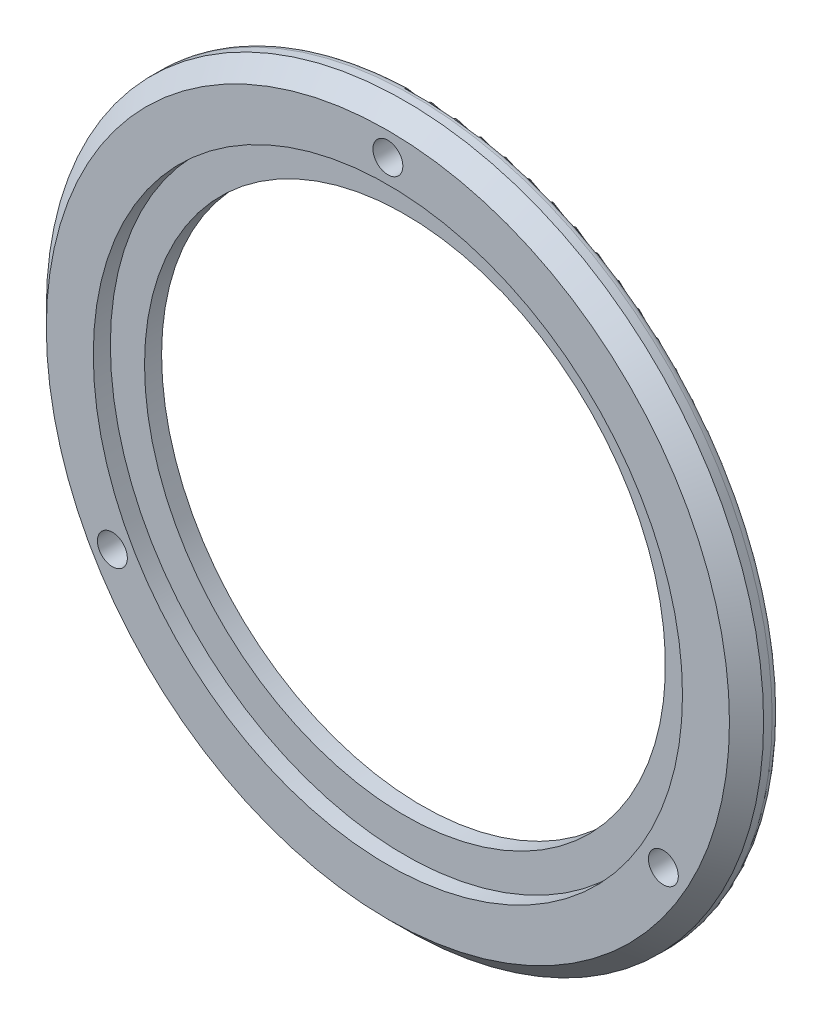
ISO-10303-21;
HEADER;
FILE_DESCRIPTION(('STEP AP214'),'2;1');
FILE_NAME('part.step','',(''),(''),'','','');
FILE_SCHEMA(('AUTOMOTIVE_DESIGN { 1 0 10303 214 1 1 1 1 }'));
ENDSEC;
DATA;
#1=APPLICATION_CONTEXT('core data for automotive mechanical design processes');
#2=APPLICATION_PROTOCOL_DEFINITION('international standard','automotive_design',2000,#1);
#3=PRODUCT_CONTEXT('',#1,'mechanical');
#4=PRODUCT('Part','Part','',(#3));
#5=PRODUCT_RELATED_PRODUCT_CATEGORY('part','',(#4));
#6=PRODUCT_DEFINITION_FORMATION('','',#4);
#7=PRODUCT_DEFINITION_CONTEXT('part definition',#1,'design');
#8=PRODUCT_DEFINITION('design','',#6,#7);
#9=PRODUCT_DEFINITION_SHAPE('','',#8);
#10=(LENGTH_UNIT() NAMED_UNIT(*) SI_UNIT(.MILLI.,.METRE.));
#11=(NAMED_UNIT(*) PLANE_ANGLE_UNIT() SI_UNIT($,.RADIAN.));
#12=(NAMED_UNIT(*) SI_UNIT($,.STERADIAN.) SOLID_ANGLE_UNIT());
#13=UNCERTAINTY_MEASURE_WITH_UNIT(LENGTH_MEASURE(1.E-05),#10,'distance_accuracy_value','');
#14=(GEOMETRIC_REPRESENTATION_CONTEXT(3) GLOBAL_UNCERTAINTY_ASSIGNED_CONTEXT((#13)) GLOBAL_UNIT_ASSIGNED_CONTEXT((#10,
#11,#12)) REPRESENTATION_CONTEXT('',''));
#15=CARTESIAN_POINT('',(0.,0.,0.));
#16=DIRECTION('',(0.,0.,1.));
#17=DIRECTION('',(1.,0.,0.));
#18=AXIS2_PLACEMENT_3D('',#15,#16,#17);
#19=CARTESIAN_POINT('',(0.,0.,4.));
#20=DIRECTION('',(0.,0.,-1.));
#21=DIRECTION('',(-1.,0.,0.));
#22=AXIS2_PLACEMENT_3D('',#19,#20,#21);
#23=CYLINDRICAL_SURFACE('',#22,30.5);
#24=CARTESIAN_POINT('',(0.,0.,0.));
#25=DIRECTION('',(0.,0.,1.));
#26=DIRECTION('',(1.,0.,0.));
#27=AXIS2_PLACEMENT_3D('',#24,#25,#26);
#28=CIRCLE('',#27,30.5);
#29=CARTESIAN_POINT('',(-30.5,0.,0.));
#30=VERTEX_POINT('',#29);
#31=EDGE_CURVE('E70',#30,#30,#28,.T.);
#32=CARTESIAN_POINT('',(0.,0.,2.));
#33=DIRECTION('',(0.,0.,1.));
#34=DIRECTION('',(1.,0.,0.));
#35=AXIS2_PLACEMENT_3D('',#32,#33,#34);
#36=CIRCLE('',#35,30.5);
#37=CARTESIAN_POINT('',(-30.5,0.,2.));
#38=VERTEX_POINT('',#37);
#39=EDGE_CURVE('E68',#38,#38,#36,.T.);
#40=CARTESIAN_POINT('',(-30.5,0.,0.));
#41=CARTESIAN_POINT('',(-30.5,0.,0.0208333333333325));
#42=CARTESIAN_POINT('',(-30.5,0.,0.0416666666666658));
#43=CARTESIAN_POINT('',(-30.5,0.,0.0833333333333326));
#44=CARTESIAN_POINT('',(-30.5,0.,0.104166666666666));
#45=CARTESIAN_POINT('',(-30.5,0.,0.145833333333333));
#46=CARTESIAN_POINT('',(-30.5,0.,0.166666666666666));
#47=CARTESIAN_POINT('',(-30.5,0.,0.208333333333333));
#48=CARTESIAN_POINT('',(-30.5,0.,0.229166666666666));
#49=CARTESIAN_POINT('',(-30.5,0.,0.270833333333333));
#50=CARTESIAN_POINT('',(-30.5,0.,0.291666666666666));
#51=CARTESIAN_POINT('',(-30.5,0.,0.333333333333333));
#52=CARTESIAN_POINT('',(-30.5,0.,0.354166666666666));
#53=CARTESIAN_POINT('',(-30.5,0.,0.395833333333333));
#54=CARTESIAN_POINT('',(-30.5,0.,0.416666666666666));
#55=CARTESIAN_POINT('',(-30.5,0.,0.458333333333333));
#56=CARTESIAN_POINT('',(-30.5,0.,0.479166666666666));
#57=CARTESIAN_POINT('',(-30.5,0.,0.520833333333333));
#58=CARTESIAN_POINT('',(-30.5,0.,0.541666666666666));
#59=CARTESIAN_POINT('',(-30.5,0.,0.583333333333333));
#60=CARTESIAN_POINT('',(-30.5,0.,0.604166666666666));
#61=CARTESIAN_POINT('',(-30.5,0.,0.645833333333333));
#62=CARTESIAN_POINT('',(-30.5,0.,0.666666666666667));
#63=CARTESIAN_POINT('',(-30.5,0.,0.708333333333333));
#64=CARTESIAN_POINT('',(-30.5,0.,0.729166666666667));
#65=CARTESIAN_POINT('',(-30.5,0.,0.770833333333334));
#66=CARTESIAN_POINT('',(-30.5,0.,0.791666666666667));
#67=CARTESIAN_POINT('',(-30.5,0.,0.833333333333334));
#68=CARTESIAN_POINT('',(-30.5,0.,0.854166666666667));
#69=CARTESIAN_POINT('',(-30.5,0.,0.895833333333334));
#70=CARTESIAN_POINT('',(-30.5,0.,0.916666666666667));
#71=CARTESIAN_POINT('',(-30.5,0.,0.958333333333334));
#72=CARTESIAN_POINT('',(-30.5,0.,0.979166666666667));
#73=CARTESIAN_POINT('',(-30.5,0.,1.02083333333333));
#74=CARTESIAN_POINT('',(-30.5,0.,1.04166666666667));
#75=CARTESIAN_POINT('',(-30.5,0.,1.08333333333333));
#76=CARTESIAN_POINT('',(-30.5,0.,1.10416666666667));
#77=CARTESIAN_POINT('',(-30.5,0.,1.14583333333333));
#78=CARTESIAN_POINT('',(-30.5,0.,1.16666666666667));
#79=CARTESIAN_POINT('',(-30.5,0.,1.20833333333333));
#80=CARTESIAN_POINT('',(-30.5,0.,1.22916666666667));
#81=CARTESIAN_POINT('',(-30.5,0.,1.27083333333333));
#82=CARTESIAN_POINT('',(-30.5,0.,1.29166666666667));
#83=CARTESIAN_POINT('',(-30.5,0.,1.33333333333333));
#84=CARTESIAN_POINT('',(-30.5,0.,1.35416666666667));
#85=CARTESIAN_POINT('',(-30.5,0.,1.39583333333333));
#86=CARTESIAN_POINT('',(-30.5,0.,1.41666666666667));
#87=CARTESIAN_POINT('',(-30.5,0.,1.45833333333333));
#88=CARTESIAN_POINT('',(-30.5,0.,1.47916666666667));
#89=CARTESIAN_POINT('',(-30.5,0.,1.52083333333333));
#90=CARTESIAN_POINT('',(-30.5,0.,1.54166666666667));
#91=CARTESIAN_POINT('',(-30.5,0.,1.58333333333333));
#92=CARTESIAN_POINT('',(-30.5,0.,1.60416666666667));
#93=CARTESIAN_POINT('',(-30.5,0.,1.64583333333333));
#94=CARTESIAN_POINT('',(-30.5,0.,1.66666666666667));
#95=CARTESIAN_POINT('',(-30.5,0.,1.70833333333333));
#96=CARTESIAN_POINT('',(-30.5,0.,1.72916666666667));
#97=CARTESIAN_POINT('',(-30.5,0.,1.77083333333333));
#98=CARTESIAN_POINT('',(-30.5,0.,1.79166666666667));
#99=CARTESIAN_POINT('',(-30.5,0.,1.83333333333333));
#100=CARTESIAN_POINT('',(-30.5,0.,1.85416666666667));
#101=CARTESIAN_POINT('',(-30.5,0.,1.89583333333333));
#102=CARTESIAN_POINT('',(-30.5,0.,1.91666666666667));
#103=CARTESIAN_POINT('',(-30.5,0.,1.95833333333333));
#104=CARTESIAN_POINT('',(-30.5,0.,1.97916666666667));
#105=CARTESIAN_POINT('',(-30.5,0.,2.));
#106=B_SPLINE_CURVE_WITH_KNOTS('',3,(#40,#41,#42,#43,#44,#45,#46,#47,#48,#49,#50,#51,#52,#53,
#54,#55,#56,#57,#58,#59,#60,#61,#62,#63,#64,#65,#66,#67,#68,#69,#70,#71,#72,#73,#74,#75,#76,#77,
#78,#79,#80,#81,#82,#83,#84,#85,#86,#87,#88,#89,#90,#91,#92,#93,#94,#95,#96,#97,#98,#99,#100,
#101,#102,#103,#104,#105),.UNSPECIFIED.,.F.,.F.,(4,2,2,2,2,2,2,2,2,2,2,2,2,2,2,2,2,2,2,2,2,2,2,
2,2,2,2,2,2,2,2,2,4),(0.,0.0625000000000001,0.125,0.1875,0.25,0.3125,0.375,0.4375,0.5,0.5625,
0.625000000000001,0.687500000000001,0.750000000000001,0.812500000000001,0.875000000000001,
0.937500000000001,1.,1.0625,1.125,1.1875,1.25,1.3125,1.375,1.4375,1.5,1.5625,1.625,1.6875,1.75,
1.8125,1.875,1.9375,2.),.UNSPECIFIED.);
#107=EDGE_CURVE('BSEAM50',#30,#38,#106,.T.);
#108=ORIENTED_EDGE('',*,*,#31,.F.);
#109=ORIENTED_EDGE('',*,*,#39,.T.);
#110=ORIENTED_EDGE('',*,*,#107,.T.);
#111=ORIENTED_EDGE('',*,*,#107,.F.);
#112=EDGE_LOOP('',(#108,#110,#109,#111));
#113=FACE_BOUND('',#112,.T.);
#114=ADVANCED_FACE('F50',(#113),#23,.F.);
#115=CARTESIAN_POINT('',(0.,0.,4.));
#116=DIRECTION('',(0.,0.,1.));
#117=DIRECTION('',(1.,0.,0.));
#118=AXIS2_PLACEMENT_3D('',#115,#116,#117);
#119=PLANE('',#118);
#120=CARTESIAN_POINT('',(32.2594462909727,-18.6249999999986,4.));
#121=DIRECTION('',(0.,0.,1.));
#122=DIRECTION('',(1.,0.,0.));
#123=AXIS2_PLACEMENT_3D('',#120,#121,#122);
#124=CIRCLE('',#123,1.75);
#125=CARTESIAN_POINT('',(34.0094462909727,-18.6249999999986,4.));
#126=VERTEX_POINT('',#125);
#127=EDGE_CURVE('E86',#126,#126,#124,.T.);
#128=ORIENTED_EDGE('',*,*,#127,.F.);
#129=EDGE_LOOP('',(#128));
#130=FACE_BOUND('',#129,.T.);
#131=CARTESIAN_POINT('',(0.,37.25,4.00000000000003));
#132=DIRECTION('',(0.,0.,1.));
#133=DIRECTION('',(1.,0.,0.));
#134=AXIS2_PLACEMENT_3D('',#131,#132,#133);
#135=CIRCLE('',#134,1.75);
#136=CARTESIAN_POINT('',(1.75,37.25,4.00000000000003));
#137=VERTEX_POINT('',#136);
#138=EDGE_CURVE('E92',#137,#137,#135,.T.);
#139=ORIENTED_EDGE('',*,*,#138,.F.);
#140=EDGE_LOOP('',(#139));
#141=FACE_BOUND('',#140,.T.);
#142=CARTESIAN_POINT('',(-32.259446290968,-18.6250000000014,4.00000000000003));
#143=DIRECTION('',(0.,0.,1.));
#144=DIRECTION('',(1.,0.,0.));
#145=AXIS2_PLACEMENT_3D('',#142,#143,#144);
#146=CIRCLE('',#145,1.75);
#147=CARTESIAN_POINT('',(-30.509446290968,-18.6250000000014,4.00000000000003));
#148=VERTEX_POINT('',#147);
#149=EDGE_CURVE('E83',#148,#148,#146,.T.);
#150=ORIENTED_EDGE('',*,*,#149,.F.);
#151=EDGE_LOOP('',(#150));
#152=FACE_BOUND('',#151,.T.);
#153=CARTESIAN_POINT('',(0.,0.,4.));
#154=DIRECTION('',(0.,0.,1.));
#155=DIRECTION('',(1.,0.,0.));
#156=AXIS2_PLACEMENT_3D('',#153,#154,#155);
#157=CIRCLE('',#156,34.5);
#158=CARTESIAN_POINT('',(34.5,0.,4.));
#159=VERTEX_POINT('',#158);
#160=EDGE_CURVE('E77',#159,#159,#157,.T.);
#161=ORIENTED_EDGE('',*,*,#160,.F.);
#162=EDGE_LOOP('',(#161));
#163=FACE_BOUND('',#162,.T.);
#164=CARTESIAN_POINT('',(0.,0.,4.));
#165=DIRECTION('',(0.,0.,1.));
#166=DIRECTION('',(1.,0.,0.));
#167=AXIS2_PLACEMENT_3D('',#164,#165,#166);
#168=CIRCLE('',#167,40.);
#169=CARTESIAN_POINT('',(-40.,0.,4.));
#170=VERTEX_POINT('',#169);
#171=EDGE_CURVE('E65',#170,#170,#168,.T.);
#172=ORIENTED_EDGE('',*,*,#171,.T.);
#173=EDGE_LOOP('',(#172));
#174=FACE_BOUND('',#173,.T.);
#175=ADVANCED_FACE('F103',(#130,#141,#152,#163,#174),#119,.T.);
#176=CARTESIAN_POINT('',(0.,0.,0.));
#177=DIRECTION('',(0.,0.,1.));
#178=DIRECTION('',(1.,0.,0.));
#179=AXIS2_PLACEMENT_3D('',#176,#177,#178);
#180=PLANE('',#179);
#181=CARTESIAN_POINT('',(0.,0.,0.));
#182=DIRECTION('',(0.,0.,1.));
#183=DIRECTION('',(1.,0.,0.));
#184=AXIS2_PLACEMENT_3D('',#181,#182,#183);
#185=CIRCLE('',#184,41.);
#186=CARTESIAN_POINT('',(41.,0.,0.));
#187=VERTEX_POINT('',#186);
#188=EDGE_CURVE('E12',#187,#187,#185,.F.);
#189=ORIENTED_EDGE('',*,*,#188,.T.);
#190=EDGE_LOOP('',(#189));
#191=FACE_BOUND('',#190,.T.);
#192=CARTESIAN_POINT('',(32.2594462909727,-18.6249999999986,0.));
#193=DIRECTION('',(0.,0.,1.));
#194=DIRECTION('',(1.,0.,0.));
#195=AXIS2_PLACEMENT_3D('',#192,#193,#194);
#196=CIRCLE('',#195,1.75);
#197=CARTESIAN_POINT('',(34.0094462909727,-18.6249999999986,0.));
#198=VERTEX_POINT('',#197);
#199=EDGE_CURVE('E95',#198,#198,#196,.T.);
#200=ORIENTED_EDGE('',*,*,#199,.T.);
#201=EDGE_LOOP('',(#200));
#202=FACE_BOUND('',#201,.T.);
#203=CARTESIAN_POINT('',(0.,37.25,0.));
#204=DIRECTION('',(0.,0.,1.));
#205=DIRECTION('',(1.,0.,0.));
#206=AXIS2_PLACEMENT_3D('',#203,#204,#205);
#207=CIRCLE('',#206,1.75);
#208=CARTESIAN_POINT('',(1.75,37.25,0.));
#209=VERTEX_POINT('',#208);
#210=EDGE_CURVE('E89',#209,#209,#207,.T.);
#211=ORIENTED_EDGE('',*,*,#210,.T.);
#212=EDGE_LOOP('',(#211));
#213=FACE_BOUND('',#212,.T.);
#214=CARTESIAN_POINT('',(-32.259446290968,-18.6250000000014,0.));
#215=DIRECTION('',(0.,0.,1.));
#216=DIRECTION('',(1.,0.,0.));
#217=AXIS2_PLACEMENT_3D('',#214,#215,#216);
#218=CIRCLE('',#217,1.75);
#219=CARTESIAN_POINT('',(-30.509446290968,-18.6250000000014,0.));
#220=VERTEX_POINT('',#219);
#221=EDGE_CURVE('E80',#220,#220,#218,.T.);
#222=ORIENTED_EDGE('',*,*,#221,.T.);
#223=EDGE_LOOP('',(#222));
#224=FACE_BOUND('',#223,.T.);
#225=ORIENTED_EDGE('',*,*,#31,.T.);
#226=EDGE_LOOP('',(#225));
#227=FACE_BOUND('',#226,.T.);
#228=ADVANCED_FACE('F106',(#191,#202,#213,#224,#227),#180,.F.);
#229=CARTESIAN_POINT('',(0.,0.,4.));
#230=DIRECTION('',(0.,0.,-1.));
#231=DIRECTION('',(-1.,0.,0.));
#232=AXIS2_PLACEMENT_3D('',#229,#230,#231);
#233=CYLINDRICAL_SURFACE('',#232,42.);
#234=CARTESIAN_POINT('',(0.,0.,1.));
#235=DIRECTION('',(0.,0.,1.));
#236=DIRECTION('',(1.,0.,0.));
#237=AXIS2_PLACEMENT_3D('',#234,#235,#236);
#238=CIRCLE('',#237,42.);
#239=CARTESIAN_POINT('',(-42.,0.,1.));
#240=VERTEX_POINT('',#239);
#241=EDGE_CURVE('E57',#240,#240,#238,.T.);
#242=CARTESIAN_POINT('',(0.,0.,1.99999999999997));
#243=DIRECTION('',(0.,0.,1.));
#244=DIRECTION('',(1.,0.,0.));
#245=AXIS2_PLACEMENT_3D('',#242,#243,#244);
#246=CIRCLE('',#245,42.);
#247=CARTESIAN_POINT('',(-42.,0.,1.99999999999997));
#248=VERTEX_POINT('',#247);
#249=EDGE_CURVE('E61',#248,#248,#246,.F.);
#250=CARTESIAN_POINT('',(-42.,0.,1.));
#251=CARTESIAN_POINT('',(-42.,0.,1.01041666666667));
#252=CARTESIAN_POINT('',(-42.,0.,1.02083333333333));
#253=CARTESIAN_POINT('',(-42.,0.,1.04166666666667));
#254=CARTESIAN_POINT('',(-42.,0.,1.05208333333333));
#255=CARTESIAN_POINT('',(-42.,0.,1.07291666666667));
#256=CARTESIAN_POINT('',(-42.,0.,1.08333333333333));
#257=CARTESIAN_POINT('',(-42.,0.,1.10416666666666));
#258=CARTESIAN_POINT('',(-42.,0.,1.11458333333333));
#259=CARTESIAN_POINT('',(-42.,0.,1.13541666666666));
#260=CARTESIAN_POINT('',(-42.,0.,1.14583333333333));
#261=CARTESIAN_POINT('',(-42.,0.,1.16666666666666));
#262=CARTESIAN_POINT('',(-42.,0.,1.17708333333333));
#263=CARTESIAN_POINT('',(-42.,0.,1.19791666666666));
#264=CARTESIAN_POINT('',(-42.,0.,1.20833333333333));
#265=CARTESIAN_POINT('',(-42.,0.,1.22916666666666));
#266=CARTESIAN_POINT('',(-42.,0.,1.23958333333333));
#267=CARTESIAN_POINT('',(-42.,0.,1.26041666666666));
#268=CARTESIAN_POINT('',(-42.,0.,1.27083333333333));
#269=CARTESIAN_POINT('',(-42.,0.,1.29166666666666));
#270=CARTESIAN_POINT('',(-42.,0.,1.30208333333333));
#271=CARTESIAN_POINT('',(-42.,0.,1.32291666666666));
#272=CARTESIAN_POINT('',(-42.,0.,1.33333333333332));
#273=CARTESIAN_POINT('',(-42.,0.,1.35416666666666));
#274=CARTESIAN_POINT('',(-42.,0.,1.36458333333332));
#275=CARTESIAN_POINT('',(-42.,0.,1.38541666666666));
#276=CARTESIAN_POINT('',(-42.,0.,1.39583333333332));
#277=CARTESIAN_POINT('',(-42.,0.,1.41666666666666));
#278=CARTESIAN_POINT('',(-42.,0.,1.42708333333332));
#279=CARTESIAN_POINT('',(-42.,0.,1.44791666666666));
#280=CARTESIAN_POINT('',(-42.,0.,1.45833333333332));
#281=CARTESIAN_POINT('',(-42.,0.,1.47916666666665));
#282=CARTESIAN_POINT('',(-42.,0.,1.48958333333332));
#283=CARTESIAN_POINT('',(-42.,0.,1.51041666666665));
#284=CARTESIAN_POINT('',(-42.,0.,1.52083333333332));
#285=CARTESIAN_POINT('',(-42.,0.,1.54166666666665));
#286=CARTESIAN_POINT('',(-42.,0.,1.55208333333332));
#287=CARTESIAN_POINT('',(-42.,0.,1.57291666666665));
#288=CARTESIAN_POINT('',(-42.,0.,1.58333333333332));
#289=CARTESIAN_POINT('',(-42.,0.,1.60416666666665));
#290=CARTESIAN_POINT('',(-42.,0.,1.61458333333332));
#291=CARTESIAN_POINT('',(-42.,0.,1.63541666666665));
#292=CARTESIAN_POINT('',(-42.,0.,1.64583333333332));
#293=CARTESIAN_POINT('',(-42.,0.,1.66666666666665));
#294=CARTESIAN_POINT('',(-42.,0.,1.67708333333332));
#295=CARTESIAN_POINT('',(-42.,0.,1.69791666666665));
#296=CARTESIAN_POINT('',(-42.,0.,1.70833333333331));
#297=CARTESIAN_POINT('',(-42.,0.,1.72916666666665));
#298=CARTESIAN_POINT('',(-42.,0.,1.73958333333331));
#299=CARTESIAN_POINT('',(-42.,0.,1.76041666666665));
#300=CARTESIAN_POINT('',(-42.,0.,1.77083333333331));
#301=CARTESIAN_POINT('',(-42.,0.,1.79166666666665));
#302=CARTESIAN_POINT('',(-42.,0.,1.80208333333331));
#303=CARTESIAN_POINT('',(-42.,0.,1.82291666666664));
#304=CARTESIAN_POINT('',(-42.,0.,1.83333333333331));
#305=CARTESIAN_POINT('',(-42.,0.,1.85416666666664));
#306=CARTESIAN_POINT('',(-42.,0.,1.86458333333331));
#307=CARTESIAN_POINT('',(-42.,0.,1.88541666666664));
#308=CARTESIAN_POINT('',(-42.,0.,1.89583333333331));
#309=CARTESIAN_POINT('',(-42.,0.,1.91666666666664));
#310=CARTESIAN_POINT('',(-42.,0.,1.92708333333331));
#311=CARTESIAN_POINT('',(-42.,0.,1.94791666666664));
#312=CARTESIAN_POINT('',(-42.,0.,1.95833333333331));
#313=CARTESIAN_POINT('',(-42.,0.,1.97916666666664));
#314=CARTESIAN_POINT('',(-42.,0.,1.98958333333331));
#315=CARTESIAN_POINT('',(-42.,0.,1.99999999999997));
#316=B_SPLINE_CURVE_WITH_KNOTS('',3,(#250,#251,#252,#253,#254,#255,#256,#257,#258,#259,#260,
#261,#262,#263,#264,#265,#266,#267,#268,#269,#270,#271,#272,#273,#274,#275,#276,#277,#278,#279,
#280,#281,#282,#283,#284,#285,#286,#287,#288,#289,#290,#291,#292,#293,#294,#295,#296,#297,#298,
#299,#300,#301,#302,#303,#304,#305,#306,#307,#308,#309,#310,#311,#312,#313,#314,#315),
.UNSPECIFIED.,.F.,.F.,(4,2,2,2,2,2,2,2,2,2,2,2,2,2,2,2,2,2,2,2,2,2,2,2,2,2,2,2,2,2,2,2,4),(0.,
0.0312499999999992,0.0624999999999983,0.093749999999997,0.124999999999996,0.156249999999995,
0.187499999999995,0.218749999999994,0.249999999999993,0.281249999999992,0.312499999999991,
0.34374999999999,0.37499999999999,0.406249999999989,0.437499999999988,0.468749999999987,
0.499999999999986,0.531249999999985,0.562499999999984,0.593749999999984,0.624999999999983,
0.656249999999982,0.687499999999981,0.71874999999998,0.749999999999979,0.781249999999979,
0.812499999999978,0.843749999999977,0.874999999999976,0.906249999999975,0.937499999999974,
0.968749999999974,0.999999999999973),.UNSPECIFIED.);
#317=EDGE_CURVE('BSEAM119',#240,#248,#316,.T.);
#318=ORIENTED_EDGE('',*,*,#241,.T.);
#319=ORIENTED_EDGE('',*,*,#249,.T.);
#320=ORIENTED_EDGE('',*,*,#317,.T.);
#321=ORIENTED_EDGE('',*,*,#317,.F.);
#322=EDGE_LOOP('',(#318,#320,#319,#321));
#323=FACE_BOUND('',#322,.T.);
#324=ADVANCED_FACE('F119',(#323),#233,.T.);
#325=CARTESIAN_POINT('',(0.,0.,4.));
#326=DIRECTION('',(0.,0.,-1.));
#327=DIRECTION('',(-1.,0.,0.));
#328=AXIS2_PLACEMENT_3D('',#325,#326,#327);
#329=CONICAL_SURFACE('',#328,40.,0.785398163397441);
#330=CARTESIAN_POINT('',(-42.,0.,1.99999999999997));
#331=CARTESIAN_POINT('',(-41.9791666666667,0.,2.02083333333331));
#332=CARTESIAN_POINT('',(-41.9583333333333,0.,2.04166666666664));
#333=CARTESIAN_POINT('',(-41.9166666666667,0.,2.08333333333331));
#334=CARTESIAN_POINT('',(-41.8958333333333,0.,2.10416666666664));
#335=CARTESIAN_POINT('',(-41.8541666666667,0.,2.14583333333331));
#336=CARTESIAN_POINT('',(-41.8333333333333,0.,2.16666666666664));
#337=CARTESIAN_POINT('',(-41.7916666666667,0.,2.20833333333331));
#338=CARTESIAN_POINT('',(-41.7708333333333,0.,2.22916666666664));
#339=CARTESIAN_POINT('',(-41.7291666666667,0.,2.27083333333331));
#340=CARTESIAN_POINT('',(-41.7083333333333,0.,2.29166666666664));
#341=CARTESIAN_POINT('',(-41.6666666666667,0.,2.33333333333331));
#342=CARTESIAN_POINT('',(-41.6458333333333,0.,2.35416666666665));
#343=CARTESIAN_POINT('',(-41.6041666666667,0.,2.39583333333331));
#344=CARTESIAN_POINT('',(-41.5833333333333,0.,2.41666666666665));
#345=CARTESIAN_POINT('',(-41.5416666666667,0.,2.45833333333331));
#346=CARTESIAN_POINT('',(-41.5208333333333,0.,2.47916666666665));
#347=CARTESIAN_POINT('',(-41.4791666666667,0.,2.52083333333331));
#348=CARTESIAN_POINT('',(-41.4583333333333,0.,2.54166666666665));
#349=CARTESIAN_POINT('',(-41.4166666666667,0.,2.58333333333332));
#350=CARTESIAN_POINT('',(-41.3958333333333,0.,2.60416666666665));
#351=CARTESIAN_POINT('',(-41.3541666666667,0.,2.64583333333332));
#352=CARTESIAN_POINT('',(-41.3333333333333,0.,2.66666666666665));
#353=CARTESIAN_POINT('',(-41.2916666666667,0.,2.70833333333332));
#354=CARTESIAN_POINT('',(-41.2708333333333,0.,2.72916666666665));
#355=CARTESIAN_POINT('',(-41.2291666666667,0.,2.77083333333332));
#356=CARTESIAN_POINT('',(-41.2083333333333,0.,2.79166666666665));
#357=CARTESIAN_POINT('',(-41.1666666666667,0.,2.83333333333332));
#358=CARTESIAN_POINT('',(-41.1458333333333,0.,2.85416666666665));
#359=CARTESIAN_POINT('',(-41.1041666666667,0.,2.89583333333332));
#360=CARTESIAN_POINT('',(-41.0833333333333,0.,2.91666666666665));
#361=CARTESIAN_POINT('',(-41.0416666666667,0.,2.95833333333332));
#362=CARTESIAN_POINT('',(-41.0208333333333,0.,2.97916666666665));
#363=CARTESIAN_POINT('',(-40.9791666666667,0.,3.02083333333332));
#364=CARTESIAN_POINT('',(-40.9583333333333,0.,3.04166666666666));
#365=CARTESIAN_POINT('',(-40.9166666666667,0.,3.08333333333332));
#366=CARTESIAN_POINT('',(-40.8958333333333,0.,3.10416666666666));
#367=CARTESIAN_POINT('',(-40.8541666666667,0.,3.14583333333332));
#368=CARTESIAN_POINT('',(-40.8333333333333,0.,3.16666666666666));
#369=CARTESIAN_POINT('',(-40.7916666666667,0.,3.20833333333332));
#370=CARTESIAN_POINT('',(-40.7708333333333,0.,3.22916666666666));
#371=CARTESIAN_POINT('',(-40.7291666666667,0.,3.27083333333333));
#372=CARTESIAN_POINT('',(-40.7083333333333,0.,3.29166666666666));
#373=CARTESIAN_POINT('',(-40.6666666666667,0.,3.33333333333333));
#374=CARTESIAN_POINT('',(-40.6458333333333,0.,3.35416666666666));
#375=CARTESIAN_POINT('',(-40.6041666666667,0.,3.39583333333333));
#376=CARTESIAN_POINT('',(-40.5833333333333,0.,3.41666666666666));
#377=CARTESIAN_POINT('',(-40.5416666666667,0.,3.45833333333333));
#378=CARTESIAN_POINT('',(-40.5208333333333,0.,3.47916666666666));
#379=CARTESIAN_POINT('',(-40.4791666666667,0.,3.52083333333333));
#380=CARTESIAN_POINT('',(-40.4583333333333,0.,3.54166666666666));
#381=CARTESIAN_POINT('',(-40.4166666666667,0.,3.58333333333333));
#382=CARTESIAN_POINT('',(-40.3958333333333,0.,3.60416666666666));
#383=CARTESIAN_POINT('',(-40.3541666666667,0.,3.64583333333333));
#384=CARTESIAN_POINT('',(-40.3333333333333,0.,3.66666666666666));
#385=CARTESIAN_POINT('',(-40.2916666666667,0.,3.70833333333333));
#386=CARTESIAN_POINT('',(-40.2708333333333,0.,3.72916666666667));
#387=CARTESIAN_POINT('',(-40.2291666666667,0.,3.77083333333333));
#388=CARTESIAN_POINT('',(-40.2083333333333,0.,3.79166666666667));
#389=CARTESIAN_POINT('',(-40.1666666666667,0.,3.83333333333333));
#390=CARTESIAN_POINT('',(-40.1458333333333,0.,3.85416666666667));
#391=CARTESIAN_POINT('',(-40.1041666666667,0.,3.89583333333333));
#392=CARTESIAN_POINT('',(-40.0833333333333,0.,3.91666666666667));
#393=CARTESIAN_POINT('',(-40.0416666666667,0.,3.95833333333334));
#394=CARTESIAN_POINT('',(-40.0208333333333,0.,3.97916666666667));
#395=CARTESIAN_POINT('',(-40.,0.,4.));
#396=B_SPLINE_CURVE_WITH_KNOTS('',3,(#330,#331,#332,#333,#334,#335,#336,#337,#338,#339,#340,
#341,#342,#343,#344,#345,#346,#347,#348,#349,#350,#351,#352,#353,#354,#355,#356,#357,#358,#359,
#360,#361,#362,#363,#364,#365,#366,#367,#368,#369,#370,#371,#372,#373,#374,#375,#376,#377,#378,
#379,#380,#381,#382,#383,#384,#385,#386,#387,#388,#389,#390,#391,#392,#393,#394,#395),
.UNSPECIFIED.,.F.,.F.,(4,2,2,2,2,2,2,2,2,2,2,2,2,2,2,2,2,2,2,2,2,2,2,2,2,2,2,2,2,2,2,2,4),(0.,
0.0883883476483191,0.176776695296638,0.265165042944957,0.353553390593277,0.441941738241596,
0.530330085889915,0.618718433538234,0.707106781186553,0.795495128834872,0.883883476483191,
0.97227182413151,1.06066017177983,1.14904851942815,1.23743686707647,1.32582521472479,
1.41421356237311,1.50260191002143,1.59099025766974,1.67937860531806,1.76776695296638,
1.8561553006147,1.94454364826302,2.03293199591134,2.12132034355966,2.20970869120798,
2.2980970388563,2.38648538650462,2.47487373415294,2.56326208180125,2.65165042944957,
2.74003877709789,2.82842712474621),.UNSPECIFIED.);
#397=EDGE_CURVE('BSEAM116',#248,#170,#396,.T.);
#398=ORIENTED_EDGE('',*,*,#249,.F.);
#399=ORIENTED_EDGE('',*,*,#171,.F.);
#400=ORIENTED_EDGE('',*,*,#397,.T.);
#401=ORIENTED_EDGE('',*,*,#397,.F.);
#402=EDGE_LOOP('',(#398,#400,#399,#401));
#403=FACE_BOUND('',#402,.T.);
#404=ADVANCED_FACE('F116',(#403),#329,.T.);
#405=CARTESIAN_POINT('',(0.,0.,2.));
#406=DIRECTION('',(0.,0.,1.));
#407=DIRECTION('',(1.,0.,0.));
#408=AXIS2_PLACEMENT_3D('',#405,#406,#407);
#409=CYLINDRICAL_SURFACE('',#408,34.5);
#410=CARTESIAN_POINT('',(0.,0.,2.));
#411=DIRECTION('',(0.,0.,1.));
#412=DIRECTION('',(1.,0.,0.));
#413=AXIS2_PLACEMENT_3D('',#410,#411,#412);
#414=CIRCLE('',#413,34.5);
#415=CARTESIAN_POINT('',(34.5,0.,2.));
#416=VERTEX_POINT('',#415);
#417=EDGE_CURVE('E71',#416,#416,#414,.T.);
#418=CARTESIAN_POINT('',(34.5,0.,2.));
#419=CARTESIAN_POINT('',(34.5,0.,2.02083333333334));
#420=CARTESIAN_POINT('',(34.5,0.,2.04166666666667));
#421=CARTESIAN_POINT('',(34.5,0.,2.08333333333334));
#422=CARTESIAN_POINT('',(34.5,0.,2.10416666666667));
#423=CARTESIAN_POINT('',(34.5,0.,2.14583333333334));
#424=CARTESIAN_POINT('',(34.5,0.,2.16666666666667));
#425=CARTESIAN_POINT('',(34.5,0.,2.20833333333334));
#426=CARTESIAN_POINT('',(34.5,0.,2.22916666666667));
#427=CARTESIAN_POINT('',(34.5,0.,2.27083333333334));
#428=CARTESIAN_POINT('',(34.5,0.,2.29166666666667));
#429=CARTESIAN_POINT('',(34.5,0.,2.33333333333334));
#430=CARTESIAN_POINT('',(34.5,0.,2.35416666666667));
#431=CARTESIAN_POINT('',(34.5,0.,2.39583333333334));
#432=CARTESIAN_POINT('',(34.5,0.,2.41666666666667));
#433=CARTESIAN_POINT('',(34.5,0.,2.45833333333334));
#434=CARTESIAN_POINT('',(34.5,0.,2.47916666666667));
#435=CARTESIAN_POINT('',(34.5,0.,2.52083333333334));
#436=CARTESIAN_POINT('',(34.5,0.,2.54166666666667));
#437=CARTESIAN_POINT('',(34.5,0.,2.58333333333334));
#438=CARTESIAN_POINT('',(34.5,0.,2.60416666666667));
#439=CARTESIAN_POINT('',(34.5,0.,2.64583333333334));
#440=CARTESIAN_POINT('',(34.5,0.,2.66666666666667));
#441=CARTESIAN_POINT('',(34.5,0.,2.70833333333334));
#442=CARTESIAN_POINT('',(34.5,0.,2.72916666666667));
#443=CARTESIAN_POINT('',(34.5,0.,2.77083333333334));
#444=CARTESIAN_POINT('',(34.5,0.,2.79166666666667));
#445=CARTESIAN_POINT('',(34.5,0.,2.83333333333334));
#446=CARTESIAN_POINT('',(34.5,0.,2.85416666666667));
#447=CARTESIAN_POINT('',(34.5,0.,2.89583333333334));
#448=CARTESIAN_POINT('',(34.5,0.,2.91666666666667));
#449=CARTESIAN_POINT('',(34.5,0.,2.95833333333334));
#450=CARTESIAN_POINT('',(34.5,0.,2.97916666666667));
#451=CARTESIAN_POINT('',(34.5,0.,3.02083333333334));
#452=CARTESIAN_POINT('',(34.5,0.,3.04166666666667));
#453=CARTESIAN_POINT('',(34.5,0.,3.08333333333334));
#454=CARTESIAN_POINT('',(34.5,0.,3.10416666666667));
#455=CARTESIAN_POINT('',(34.5,0.,3.14583333333334));
#456=CARTESIAN_POINT('',(34.5,0.,3.16666666666667));
#457=CARTESIAN_POINT('',(34.5,0.,3.20833333333334));
#458=CARTESIAN_POINT('',(34.5,0.,3.22916666666667));
#459=CARTESIAN_POINT('',(34.5,0.,3.27083333333334));
#460=CARTESIAN_POINT('',(34.5,0.,3.29166666666667));
#461=CARTESIAN_POINT('',(34.5,0.,3.33333333333334));
#462=CARTESIAN_POINT('',(34.5,0.,3.35416666666667));
#463=CARTESIAN_POINT('',(34.5,0.,3.39583333333334));
#464=CARTESIAN_POINT('',(34.5,0.,3.41666666666667));
#465=CARTESIAN_POINT('',(34.5,0.,3.45833333333334));
#466=CARTESIAN_POINT('',(34.5,0.,3.47916666666667));
#467=CARTESIAN_POINT('',(34.5,0.,3.52083333333334));
#468=CARTESIAN_POINT('',(34.5,0.,3.54166666666667));
#469=CARTESIAN_POINT('',(34.5,0.,3.58333333333334));
#470=CARTESIAN_POINT('',(34.5,0.,3.60416666666667));
#471=CARTESIAN_POINT('',(34.5,0.,3.64583333333334));
#472=CARTESIAN_POINT('',(34.5,0.,3.66666666666667));
#473=CARTESIAN_POINT('',(34.5,0.,3.70833333333334));
#474=CARTESIAN_POINT('',(34.5,0.,3.72916666666667));
#475=CARTESIAN_POINT('',(34.5,0.,3.77083333333334));
#476=CARTESIAN_POINT('',(34.5,0.,3.79166666666667));
#477=CARTESIAN_POINT('',(34.5,0.,3.83333333333334));
#478=CARTESIAN_POINT('',(34.5,0.,3.85416666666667));
#479=CARTESIAN_POINT('',(34.5,0.,3.89583333333334));
#480=CARTESIAN_POINT('',(34.5,0.,3.91666666666667));
#481=CARTESIAN_POINT('',(34.5,0.,3.95833333333334));
#482=CARTESIAN_POINT('',(34.5,0.,3.97916666666667));
#483=CARTESIAN_POINT('',(34.5,0.,4.));
#484=B_SPLINE_CURVE_WITH_KNOTS('',3,(#418,#419,#420,#421,#422,#423,#424,#425,#426,#427,#428,
#429,#430,#431,#432,#433,#434,#435,#436,#437,#438,#439,#440,#441,#442,#443,#444,#445,#446,#447,
#448,#449,#450,#451,#452,#453,#454,#455,#456,#457,#458,#459,#460,#461,#462,#463,#464,#465,#466,
#467,#468,#469,#470,#471,#472,#473,#474,#475,#476,#477,#478,#479,#480,#481,#482,#483),
.UNSPECIFIED.,.F.,.F.,(4,2,2,2,2,2,2,2,2,2,2,2,2,2,2,2,2,2,2,2,2,2,2,2,2,2,2,2,2,2,2,2,4),(0.,
0.0624999999999996,0.125,0.1875,0.25,0.3125,0.375,0.4375,0.5,0.5625,0.625,0.6875,0.75,0.8125,
0.875,0.9375,1.,1.0625,1.125,1.1875,1.25,1.3125,1.375,1.4375,1.5,1.5625,1.625,1.6875,1.75,
1.8125,1.875,1.9375,2.),.UNSPECIFIED.);
#485=EDGE_CURVE('BSEAM118',#416,#159,#484,.T.);
#486=ORIENTED_EDGE('',*,*,#417,.F.);
#487=ORIENTED_EDGE('',*,*,#160,.T.);
#488=ORIENTED_EDGE('',*,*,#485,.T.);
#489=ORIENTED_EDGE('',*,*,#485,.F.);
#490=EDGE_LOOP('',(#486,#488,#487,#489));
#491=FACE_BOUND('',#490,.T.);
#492=ADVANCED_FACE('F118',(#491),#409,.F.);
#493=CARTESIAN_POINT('',(0.,0.,2.));
#494=DIRECTION('',(0.,0.,1.));
#495=DIRECTION('',(1.,0.,0.));
#496=AXIS2_PLACEMENT_3D('',#493,#494,#495);
#497=PLANE('',#496);
#498=ORIENTED_EDGE('',*,*,#39,.F.);
#499=EDGE_LOOP('',(#498));
#500=FACE_BOUND('',#499,.T.);
#501=ORIENTED_EDGE('',*,*,#417,.T.);
#502=EDGE_LOOP('',(#501));
#503=FACE_BOUND('',#502,.T.);
#504=ADVANCED_FACE('F125',(#500,#503),#497,.T.);
#505=CARTESIAN_POINT('',(-32.259446290968,-18.6250000000014,0.));
#506=DIRECTION('',(0.,0.,1.));
#507=DIRECTION('',(1.,0.,0.));
#508=AXIS2_PLACEMENT_3D('',#505,#506,#507);
#509=CYLINDRICAL_SURFACE('',#508,1.75);
#510=CARTESIAN_POINT('',(-30.509446290968,-18.6250000000014,0.));
#511=CARTESIAN_POINT('',(-30.509446290968,-18.6250000000014,0.0416666666666944));
#512=CARTESIAN_POINT('',(-30.509446290968,-18.6250000000014,0.0833333333333612));
#513=CARTESIAN_POINT('',(-30.509446290968,-18.6250000000014,0.166666666666695));
#514=CARTESIAN_POINT('',(-30.509446290968,-18.6250000000014,0.208333333333361));
#515=CARTESIAN_POINT('',(-30.509446290968,-18.6250000000014,0.291666666666695));
#516=CARTESIAN_POINT('',(-30.509446290968,-18.6250000000014,0.333333333333361));
#517=CARTESIAN_POINT('',(-30.509446290968,-18.6250000000014,0.416666666666695));
#518=CARTESIAN_POINT('',(-30.509446290968,-18.6250000000014,0.458333333333362));
#519=CARTESIAN_POINT('',(-30.509446290968,-18.6250000000014,0.541666666666695));
#520=CARTESIAN_POINT('',(-30.509446290968,-18.6250000000014,0.583333333333362));
#521=CARTESIAN_POINT('',(-30.509446290968,-18.6250000000014,0.666666666666695));
#522=CARTESIAN_POINT('',(-30.509446290968,-18.6250000000014,0.708333333333362));
#523=CARTESIAN_POINT('',(-30.509446290968,-18.6250000000014,0.791666666666695));
#524=CARTESIAN_POINT('',(-30.509446290968,-18.6250000000014,0.833333333333362));
#525=CARTESIAN_POINT('',(-30.509446290968,-18.6250000000014,0.916666666666695));
#526=CARTESIAN_POINT('',(-30.509446290968,-18.6250000000014,0.958333333333362));
#527=CARTESIAN_POINT('',(-30.509446290968,-18.6250000000014,1.0416666666667));
#528=CARTESIAN_POINT('',(-30.509446290968,-18.6250000000014,1.08333333333336));
#529=CARTESIAN_POINT('',(-30.509446290968,-18.6250000000014,1.1666666666667));
#530=CARTESIAN_POINT('',(-30.509446290968,-18.6250000000014,1.20833333333336));
#531=CARTESIAN_POINT('',(-30.509446290968,-18.6250000000014,1.2916666666667));
#532=CARTESIAN_POINT('',(-30.509446290968,-18.6250000000014,1.33333333333336));
#533=CARTESIAN_POINT('',(-30.509446290968,-18.6250000000014,1.4166666666667));
#534=CARTESIAN_POINT('',(-30.509446290968,-18.6250000000014,1.45833333333336));
#535=CARTESIAN_POINT('',(-30.509446290968,-18.6250000000014,1.5416666666667));
#536=CARTESIAN_POINT('',(-30.509446290968,-18.6250000000014,1.58333333333336));
#537=CARTESIAN_POINT('',(-30.509446290968,-18.6250000000014,1.6666666666667));
#538=CARTESIAN_POINT('',(-30.509446290968,-18.6250000000014,1.70833333333336));
#539=CARTESIAN_POINT('',(-30.509446290968,-18.6250000000014,1.7916666666667));
#540=CARTESIAN_POINT('',(-30.509446290968,-18.6250000000014,1.83333333333336));
#541=CARTESIAN_POINT('',(-30.509446290968,-18.6250000000014,1.9166666666667));
#542=CARTESIAN_POINT('',(-30.509446290968,-18.6250000000014,1.95833333333336));
#543=CARTESIAN_POINT('',(-30.509446290968,-18.6250000000014,2.0416666666667));
#544=CARTESIAN_POINT('',(-30.509446290968,-18.6250000000014,2.08333333333336));
#545=CARTESIAN_POINT('',(-30.509446290968,-18.6250000000014,2.1666666666667));
#546=CARTESIAN_POINT('',(-30.509446290968,-18.6250000000014,2.20833333333336));
#547=CARTESIAN_POINT('',(-30.509446290968,-18.6250000000014,2.2916666666667));
#548=CARTESIAN_POINT('',(-30.509446290968,-18.6250000000014,2.33333333333336));
#549=CARTESIAN_POINT('',(-30.509446290968,-18.6250000000014,2.4166666666667));
#550=CARTESIAN_POINT('',(-30.509446290968,-18.6250000000014,2.45833333333336));
#551=CARTESIAN_POINT('',(-30.509446290968,-18.6250000000014,2.5416666666667));
#552=CARTESIAN_POINT('',(-30.509446290968,-18.6250000000014,2.58333333333336));
#553=CARTESIAN_POINT('',(-30.509446290968,-18.6250000000014,2.6666666666667));
#554=CARTESIAN_POINT('',(-30.509446290968,-18.6250000000014,2.70833333333336));
#555=CARTESIAN_POINT('',(-30.509446290968,-18.6250000000014,2.7916666666667));
#556=CARTESIAN_POINT('',(-30.509446290968,-18.6250000000014,2.83333333333336));
#557=CARTESIAN_POINT('',(-30.509446290968,-18.6250000000014,2.9166666666667));
#558=CARTESIAN_POINT('',(-30.509446290968,-18.6250000000014,2.95833333333336));
#559=CARTESIAN_POINT('',(-30.509446290968,-18.6250000000014,3.0416666666667));
#560=CARTESIAN_POINT('',(-30.509446290968,-18.6250000000014,3.08333333333336));
#561=CARTESIAN_POINT('',(-30.509446290968,-18.6250000000014,3.1666666666667));
#562=CARTESIAN_POINT('',(-30.509446290968,-18.6250000000014,3.20833333333336));
#563=CARTESIAN_POINT('',(-30.509446290968,-18.6250000000014,3.2916666666667));
#564=CARTESIAN_POINT('',(-30.509446290968,-18.6250000000014,3.33333333333336));
#565=CARTESIAN_POINT('',(-30.509446290968,-18.6250000000014,3.4166666666667));
#566=CARTESIAN_POINT('',(-30.509446290968,-18.6250000000014,3.45833333333337));
#567=CARTESIAN_POINT('',(-30.509446290968,-18.6250000000014,3.5416666666667));
#568=CARTESIAN_POINT('',(-30.509446290968,-18.6250000000014,3.58333333333337));
#569=CARTESIAN_POINT('',(-30.509446290968,-18.6250000000014,3.6666666666667));
#570=CARTESIAN_POINT('',(-30.509446290968,-18.6250000000014,3.70833333333337));
#571=CARTESIAN_POINT('',(-30.509446290968,-18.6250000000014,3.7916666666667));
#572=CARTESIAN_POINT('',(-30.509446290968,-18.6250000000014,3.83333333333337));
#573=CARTESIAN_POINT('',(-30.509446290968,-18.6250000000014,3.9166666666667));
#574=CARTESIAN_POINT('',(-30.509446290968,-18.6250000000014,3.95833333333337));
#575=CARTESIAN_POINT('',(-30.509446290968,-18.6250000000014,4.00000000000003));
#576=B_SPLINE_CURVE_WITH_KNOTS('',3,(#510,#511,#512,#513,#514,#515,#516,#517,#518,#519,#520,
#521,#522,#523,#524,#525,#526,#527,#528,#529,#530,#531,#532,#533,#534,#535,#536,#537,#538,#539,
#540,#541,#542,#543,#544,#545,#546,#547,#548,#549,#550,#551,#552,#553,#554,#555,#556,#557,#558,
#559,#560,#561,#562,#563,#564,#565,#566,#567,#568,#569,#570,#571,#572,#573,#574,#575),
.UNSPECIFIED.,.F.,.F.,(4,2,2,2,2,2,2,2,2,2,2,2,2,2,2,2,2,2,2,2,2,2,2,2,2,2,2,2,2,2,2,2,4),(0.,
0.125,0.25,0.375,0.500000000000001,0.625000000000001,0.750000000000001,0.875000000000001,1.,
1.125,1.25,1.375,1.5,1.625,1.75,1.875,2.,2.125,2.25,2.375,2.5,2.625,2.75,2.875,3.,3.125,3.25,
3.375,3.5,3.625,3.75,3.875,4.),.UNSPECIFIED.);
#577=EDGE_CURVE('BSEAM150',#220,#148,#576,.T.);
#578=ORIENTED_EDGE('',*,*,#221,.F.);
#579=ORIENTED_EDGE('',*,*,#149,.T.);
#580=ORIENTED_EDGE('',*,*,#577,.T.);
#581=ORIENTED_EDGE('',*,*,#577,.F.);
#582=EDGE_LOOP('',(#578,#580,#579,#581));
#583=FACE_BOUND('',#582,.T.);
#584=ADVANCED_FACE('F150',(#583),#509,.F.);
#585=CARTESIAN_POINT('',(0.,37.25,0.));
#586=DIRECTION('',(0.,0.,1.));
#587=DIRECTION('',(1.,0.,0.));
#588=AXIS2_PLACEMENT_3D('',#585,#586,#587);
#589=CYLINDRICAL_SURFACE('',#588,1.75);
#590=CARTESIAN_POINT('',(1.75,37.25,0.));
#591=CARTESIAN_POINT('',(1.75,37.25,0.0416666666666944));
#592=CARTESIAN_POINT('',(1.75,37.25,0.0833333333333612));
#593=CARTESIAN_POINT('',(1.75,37.25,0.166666666666695));
#594=CARTESIAN_POINT('',(1.75,37.25,0.208333333333361));
#595=CARTESIAN_POINT('',(1.75,37.25,0.291666666666695));
#596=CARTESIAN_POINT('',(1.75,37.25,0.333333333333361));
#597=CARTESIAN_POINT('',(1.75,37.25,0.416666666666695));
#598=CARTESIAN_POINT('',(1.75,37.25,0.458333333333362));
#599=CARTESIAN_POINT('',(1.75,37.25,0.541666666666695));
#600=CARTESIAN_POINT('',(1.75,37.25,0.583333333333362));
#601=CARTESIAN_POINT('',(1.75,37.25,0.666666666666695));
#602=CARTESIAN_POINT('',(1.75,37.25,0.708333333333362));
#603=CARTESIAN_POINT('',(1.75,37.25,0.791666666666695));
#604=CARTESIAN_POINT('',(1.75,37.25,0.833333333333362));
#605=CARTESIAN_POINT('',(1.75,37.25,0.916666666666695));
#606=CARTESIAN_POINT('',(1.75,37.25,0.958333333333362));
#607=CARTESIAN_POINT('',(1.75,37.25,1.0416666666667));
#608=CARTESIAN_POINT('',(1.75,37.25,1.08333333333336));
#609=CARTESIAN_POINT('',(1.75,37.25,1.1666666666667));
#610=CARTESIAN_POINT('',(1.75,37.25,1.20833333333336));
#611=CARTESIAN_POINT('',(1.75,37.25,1.2916666666667));
#612=CARTESIAN_POINT('',(1.75,37.25,1.33333333333336));
#613=CARTESIAN_POINT('',(1.75,37.25,1.4166666666667));
#614=CARTESIAN_POINT('',(1.75,37.25,1.45833333333336));
#615=CARTESIAN_POINT('',(1.75,37.25,1.5416666666667));
#616=CARTESIAN_POINT('',(1.75,37.25,1.58333333333336));
#617=CARTESIAN_POINT('',(1.75,37.25,1.6666666666667));
#618=CARTESIAN_POINT('',(1.75,37.25,1.70833333333336));
#619=CARTESIAN_POINT('',(1.75,37.25,1.7916666666667));
#620=CARTESIAN_POINT('',(1.75,37.25,1.83333333333336));
#621=CARTESIAN_POINT('',(1.75,37.25,1.9166666666667));
#622=CARTESIAN_POINT('',(1.75,37.25,1.95833333333336));
#623=CARTESIAN_POINT('',(1.75,37.25,2.0416666666667));
#624=CARTESIAN_POINT('',(1.75,37.25,2.08333333333336));
#625=CARTESIAN_POINT('',(1.75,37.25,2.1666666666667));
#626=CARTESIAN_POINT('',(1.75,37.25,2.20833333333336));
#627=CARTESIAN_POINT('',(1.75,37.25,2.2916666666667));
#628=CARTESIAN_POINT('',(1.75,37.25,2.33333333333336));
#629=CARTESIAN_POINT('',(1.75,37.25,2.4166666666667));
#630=CARTESIAN_POINT('',(1.75,37.25,2.45833333333336));
#631=CARTESIAN_POINT('',(1.75,37.25,2.5416666666667));
#632=CARTESIAN_POINT('',(1.75,37.25,2.58333333333336));
#633=CARTESIAN_POINT('',(1.75,37.25,2.6666666666667));
#634=CARTESIAN_POINT('',(1.75,37.25,2.70833333333336));
#635=CARTESIAN_POINT('',(1.75,37.25,2.7916666666667));
#636=CARTESIAN_POINT('',(1.75,37.25,2.83333333333336));
#637=CARTESIAN_POINT('',(1.75,37.25,2.9166666666667));
#638=CARTESIAN_POINT('',(1.75,37.25,2.95833333333336));
#639=CARTESIAN_POINT('',(1.75,37.25,3.0416666666667));
#640=CARTESIAN_POINT('',(1.75,37.25,3.08333333333336));
#641=CARTESIAN_POINT('',(1.75,37.25,3.1666666666667));
#642=CARTESIAN_POINT('',(1.75,37.25,3.20833333333336));
#643=CARTESIAN_POINT('',(1.75,37.25,3.2916666666667));
#644=CARTESIAN_POINT('',(1.75,37.25,3.33333333333336));
#645=CARTESIAN_POINT('',(1.75,37.25,3.4166666666667));
#646=CARTESIAN_POINT('',(1.75,37.25,3.45833333333337));
#647=CARTESIAN_POINT('',(1.75,37.25,3.5416666666667));
#648=CARTESIAN_POINT('',(1.75,37.25,3.58333333333337));
#649=CARTESIAN_POINT('',(1.75,37.25,3.6666666666667));
#650=CARTESIAN_POINT('',(1.75,37.25,3.70833333333337));
#651=CARTESIAN_POINT('',(1.75,37.25,3.7916666666667));
#652=CARTESIAN_POINT('',(1.75,37.25,3.83333333333337));
#653=CARTESIAN_POINT('',(1.75,37.25,3.9166666666667));
#654=CARTESIAN_POINT('',(1.75,37.25,3.95833333333337));
#655=CARTESIAN_POINT('',(1.75,37.25,4.00000000000003));
#656=B_SPLINE_CURVE_WITH_KNOTS('',3,(#590,#591,#592,#593,#594,#595,#596,#597,#598,#599,#600,
#601,#602,#603,#604,#605,#606,#607,#608,#609,#610,#611,#612,#613,#614,#615,#616,#617,#618,#619,
#620,#621,#622,#623,#624,#625,#626,#627,#628,#629,#630,#631,#632,#633,#634,#635,#636,#637,#638,
#639,#640,#641,#642,#643,#644,#645,#646,#647,#648,#649,#650,#651,#652,#653,#654,#655),
.UNSPECIFIED.,.F.,.F.,(4,2,2,2,2,2,2,2,2,2,2,2,2,2,2,2,2,2,2,2,2,2,2,2,2,2,2,2,2,2,2,2,4),(0.,
0.125,0.25,0.375,0.500000000000001,0.625000000000001,0.750000000000001,0.875000000000001,1.,
1.125,1.25,1.375,1.5,1.625,1.75,1.875,2.,2.125,2.25,2.375,2.5,2.625,2.75,2.875,3.,3.125,3.25,
3.375,3.5,3.625,3.75,3.875,4.),.UNSPECIFIED.);
#657=EDGE_CURVE('BSEAM153',#209,#137,#656,.T.);
#658=ORIENTED_EDGE('',*,*,#210,.F.);
#659=ORIENTED_EDGE('',*,*,#138,.T.);
#660=ORIENTED_EDGE('',*,*,#657,.T.);
#661=ORIENTED_EDGE('',*,*,#657,.F.);
#662=EDGE_LOOP('',(#658,#660,#659,#661));
#663=FACE_BOUND('',#662,.T.);
#664=ADVANCED_FACE('F153',(#663),#589,.F.);
#665=CARTESIAN_POINT('',(32.2594462909727,-18.6249999999986,0.));
#666=DIRECTION('',(0.,0.,1.));
#667=DIRECTION('',(1.,0.,0.));
#668=AXIS2_PLACEMENT_3D('',#665,#666,#667);
#669=CYLINDRICAL_SURFACE('',#668,1.75);
#670=CARTESIAN_POINT('',(34.0094462909727,-18.6249999999986,0.));
#671=CARTESIAN_POINT('',(34.0094462909727,-18.6249999999986,0.0416666666666941));
#672=CARTESIAN_POINT('',(34.0094462909727,-18.6249999999986,0.0833333333333606));
#673=CARTESIAN_POINT('',(34.0094462909727,-18.6249999999986,0.166666666666693));
#674=CARTESIAN_POINT('',(34.0094462909727,-18.6249999999986,0.20833333333336));
#675=CARTESIAN_POINT('',(34.0094462909727,-18.6249999999986,0.291666666666693));
#676=CARTESIAN_POINT('',(34.0094462909727,-18.6249999999986,0.333333333333359));
#677=CARTESIAN_POINT('',(34.0094462909727,-18.6249999999986,0.416666666666692));
#678=CARTESIAN_POINT('',(34.0094462909727,-18.6249999999986,0.458333333333358));
#679=CARTESIAN_POINT('',(34.0094462909727,-18.6249999999986,0.541666666666691));
#680=CARTESIAN_POINT('',(34.0094462909727,-18.6249999999986,0.583333333333358));
#681=CARTESIAN_POINT('',(34.0094462909727,-18.6249999999986,0.66666666666669));
#682=CARTESIAN_POINT('',(34.0094462909727,-18.6249999999986,0.708333333333357));
#683=CARTESIAN_POINT('',(34.0094462909727,-18.6249999999986,0.79166666666669));
#684=CARTESIAN_POINT('',(34.0094462909727,-18.6249999999986,0.833333333333356));
#685=CARTESIAN_POINT('',(34.0094462909727,-18.6249999999986,0.916666666666689));
#686=CARTESIAN_POINT('',(34.0094462909727,-18.6249999999986,0.958333333333355));
#687=CARTESIAN_POINT('',(34.0094462909727,-18.6249999999986,1.04166666666669));
#688=CARTESIAN_POINT('',(34.0094462909727,-18.6249999999986,1.08333333333335));
#689=CARTESIAN_POINT('',(34.0094462909727,-18.6249999999986,1.16666666666669));
#690=CARTESIAN_POINT('',(34.0094462909727,-18.6249999999986,1.20833333333335));
#691=CARTESIAN_POINT('',(34.0094462909727,-18.6249999999986,1.29166666666669));
#692=CARTESIAN_POINT('',(34.0094462909727,-18.6249999999986,1.33333333333335));
#693=CARTESIAN_POINT('',(34.0094462909727,-18.6249999999986,1.41666666666669));
#694=CARTESIAN_POINT('',(34.0094462909727,-18.6249999999986,1.45833333333335));
#695=CARTESIAN_POINT('',(34.0094462909727,-18.6249999999986,1.54166666666669));
#696=CARTESIAN_POINT('',(34.0094462909727,-18.6249999999986,1.58333333333335));
#697=CARTESIAN_POINT('',(34.0094462909727,-18.6249999999986,1.66666666666668));
#698=CARTESIAN_POINT('',(34.0094462909727,-18.6249999999986,1.70833333333335));
#699=CARTESIAN_POINT('',(34.0094462909727,-18.6249999999986,1.79166666666668));
#700=CARTESIAN_POINT('',(34.0094462909727,-18.6249999999986,1.83333333333335));
#701=CARTESIAN_POINT('',(34.0094462909727,-18.6249999999986,1.91666666666668));
#702=CARTESIAN_POINT('',(34.0094462909727,-18.6249999999986,1.95833333333335));
#703=CARTESIAN_POINT('',(34.0094462909727,-18.6249999999986,2.04166666666668));
#704=CARTESIAN_POINT('',(34.0094462909727,-18.6249999999986,2.08333333333335));
#705=CARTESIAN_POINT('',(34.0094462909727,-18.6249999999986,2.16666666666668));
#706=CARTESIAN_POINT('',(34.0094462909727,-18.6249999999986,2.20833333333335));
#707=CARTESIAN_POINT('',(34.0094462909727,-18.6249999999986,2.29166666666668));
#708=CARTESIAN_POINT('',(34.0094462909727,-18.6249999999986,2.33333333333335));
#709=CARTESIAN_POINT('',(34.0094462909727,-18.6249999999986,2.41666666666668));
#710=CARTESIAN_POINT('',(34.0094462909727,-18.6249999999986,2.45833333333335));
#711=CARTESIAN_POINT('',(34.0094462909727,-18.6249999999986,2.54166666666668));
#712=CARTESIAN_POINT('',(34.0094462909727,-18.6249999999986,2.58333333333335));
#713=CARTESIAN_POINT('',(34.0094462909727,-18.6249999999986,2.66666666666668));
#714=CARTESIAN_POINT('',(34.0094462909727,-18.6249999999986,2.70833333333335));
#715=CARTESIAN_POINT('',(34.0094462909727,-18.6249999999986,2.79166666666668));
#716=CARTESIAN_POINT('',(34.0094462909727,-18.6249999999986,2.83333333333335));
#717=CARTESIAN_POINT('',(34.0094462909727,-18.6249999999986,2.91666666666668));
#718=CARTESIAN_POINT('',(34.0094462909727,-18.6249999999986,2.95833333333334));
#719=CARTESIAN_POINT('',(34.0094462909727,-18.6249999999986,3.04166666666668));
#720=CARTESIAN_POINT('',(34.0094462909727,-18.6249999999986,3.08333333333334));
#721=CARTESIAN_POINT('',(34.0094462909727,-18.6249999999986,3.16666666666668));
#722=CARTESIAN_POINT('',(34.0094462909727,-18.6249999999986,3.20833333333334));
#723=CARTESIAN_POINT('',(34.0094462909727,-18.6249999999986,3.29166666666667));
#724=CARTESIAN_POINT('',(34.0094462909727,-18.6249999999986,3.33333333333334));
#725=CARTESIAN_POINT('',(34.0094462909727,-18.6249999999986,3.41666666666667));
#726=CARTESIAN_POINT('',(34.0094462909727,-18.6249999999986,3.45833333333334));
#727=CARTESIAN_POINT('',(34.0094462909727,-18.6249999999986,3.54166666666667));
#728=CARTESIAN_POINT('',(34.0094462909727,-18.6249999999986,3.58333333333334));
#729=CARTESIAN_POINT('',(34.0094462909727,-18.6249999999986,3.66666666666667));
#730=CARTESIAN_POINT('',(34.0094462909727,-18.6249999999986,3.70833333333334));
#731=CARTESIAN_POINT('',(34.0094462909727,-18.6249999999986,3.79166666666667));
#732=CARTESIAN_POINT('',(34.0094462909727,-18.6249999999986,3.83333333333334));
#733=CARTESIAN_POINT('',(34.0094462909727,-18.6249999999986,3.91666666666667));
#734=CARTESIAN_POINT('',(34.0094462909727,-18.6249999999986,3.95833333333334));
#735=CARTESIAN_POINT('',(34.0094462909727,-18.6249999999986,4.));
#736=B_SPLINE_CURVE_WITH_KNOTS('',3,(#670,#671,#672,#673,#674,#675,#676,#677,#678,#679,#680,
#681,#682,#683,#684,#685,#686,#687,#688,#689,#690,#691,#692,#693,#694,#695,#696,#697,#698,#699,
#700,#701,#702,#703,#704,#705,#706,#707,#708,#709,#710,#711,#712,#713,#714,#715,#716,#717,#718,
#719,#720,#721,#722,#723,#724,#725,#726,#727,#728,#729,#730,#731,#732,#733,#734,#735),
.UNSPECIFIED.,.F.,.F.,(4,2,2,2,2,2,2,2,2,2,2,2,2,2,2,2,2,2,2,2,2,2,2,2,2,2,2,2,2,2,2,2,4),(0.,
0.124999999999999,0.249999999999999,0.374999999999998,0.499999999999997,0.624999999999996,
0.749999999999996,0.874999999999995,0.999999999999994,1.12499999999999,1.24999999999999,
1.37499999999999,1.49999999999999,1.62499999999999,1.74999999999999,1.87499999999999,
1.99999999999999,2.12499999999999,2.24999999999999,2.37499999999999,2.49999999999999,
2.62499999999998,2.74999999999998,2.87499999999998,2.99999999999998,3.12499999999998,
3.24999999999998,3.37499999999998,3.49999999999998,3.62499999999998,3.74999999999998,
3.87499999999998,3.99999999999998),.UNSPECIFIED.);
#737=EDGE_CURVE('BSEAM101',#198,#126,#736,.T.);
#738=ORIENTED_EDGE('',*,*,#199,.F.);
#739=ORIENTED_EDGE('',*,*,#127,.T.);
#740=ORIENTED_EDGE('',*,*,#737,.T.);
#741=ORIENTED_EDGE('',*,*,#737,.F.);
#742=EDGE_LOOP('',(#738,#740,#739,#741));
#743=FACE_BOUND('',#742,.T.);
#744=ADVANCED_FACE('F101',(#743),#669,.F.);
#745=CARTESIAN_POINT('',(0.,0.,1.));
#746=DIRECTION('',(0.,0.,1.));
#747=DIRECTION('',(1.,0.,0.));
#748=AXIS2_PLACEMENT_3D('',#745,#746,#747);
#749=TOROIDAL_SURFACE('',#748,41.,1.);
#750=ORIENTED_EDGE('',*,*,#188,.F.);
#751=EDGE_LOOP('',(#750));
#752=FACE_BOUND('',#751,.T.);
#753=ORIENTED_EDGE('',*,*,#241,.F.);
#754=EDGE_LOOP('',(#753));
#755=FACE_BOUND('',#754,.T.);
#756=ADVANCED_FACE('F52',(#752,#755),#749,.T.);
#757=CLOSED_SHELL('',(#114,#175,#228,#324,#404,#492,#504,#584,#664,#744,#756));
#758=MANIFOLD_SOLID_BREP('B2',#757);
#759=ADVANCED_BREP_SHAPE_REPRESENTATION('',(#18,#758),#14);
#760=SHAPE_DEFINITION_REPRESENTATION(#9,#759);
ENDSEC;
END-ISO-10303-21;
